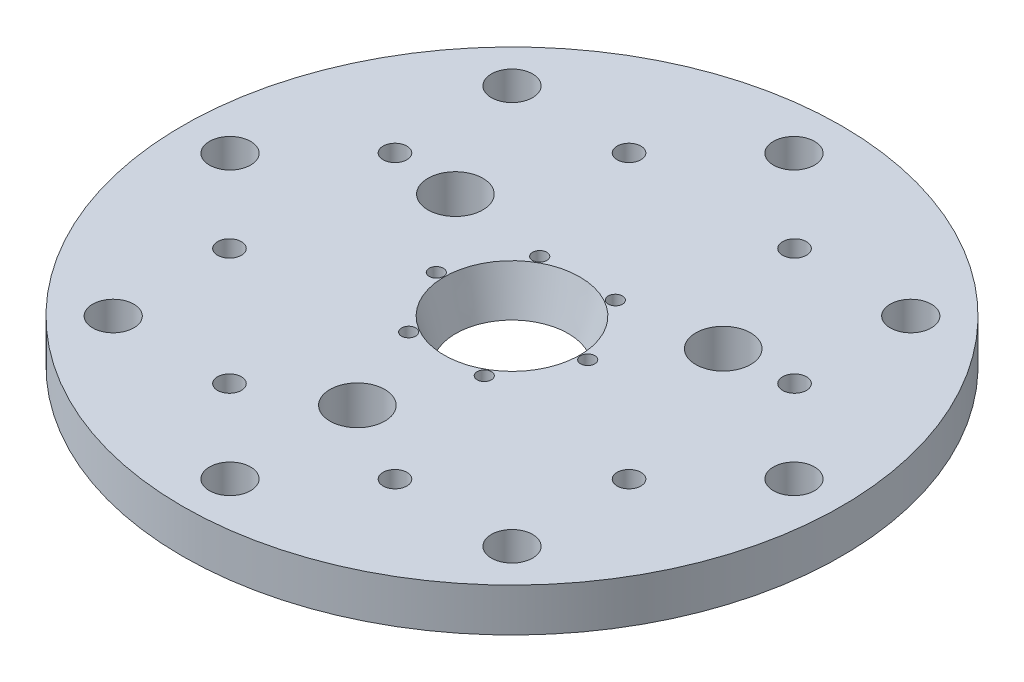
ISO-10303-21;
HEADER;
FILE_DESCRIPTION(('STEP AP214'),'2;1');
FILE_NAME('part.step','',(''),(''),'','','');
FILE_SCHEMA(('AUTOMOTIVE_DESIGN { 1 0 10303 214 1 1 1 1 }'));
ENDSEC;
DATA;
#1=APPLICATION_CONTEXT('core data for automotive mechanical design processes');
#2=APPLICATION_PROTOCOL_DEFINITION('international standard','automotive_design',2000,#1);
#3=PRODUCT_CONTEXT('',#1,'mechanical');
#4=PRODUCT('Part','Part','',(#3));
#5=PRODUCT_RELATED_PRODUCT_CATEGORY('part','',(#4));
#6=PRODUCT_DEFINITION_FORMATION('','',#4);
#7=PRODUCT_DEFINITION_CONTEXT('part definition',#1,'design');
#8=PRODUCT_DEFINITION('design','',#6,#7);
#9=PRODUCT_DEFINITION_SHAPE('','',#8);
#10=(LENGTH_UNIT() NAMED_UNIT(*) SI_UNIT(.MILLI.,.METRE.));
#11=(NAMED_UNIT(*) PLANE_ANGLE_UNIT() SI_UNIT($,.RADIAN.));
#12=(NAMED_UNIT(*) SI_UNIT($,.STERADIAN.) SOLID_ANGLE_UNIT());
#13=UNCERTAINTY_MEASURE_WITH_UNIT(LENGTH_MEASURE(1.E-05),#10,'distance_accuracy_value','');
#14=(GEOMETRIC_REPRESENTATION_CONTEXT(3) GLOBAL_UNCERTAINTY_ASSIGNED_CONTEXT((#13)) GLOBAL_UNIT_ASSIGNED_CONTEXT((#10,
#11,#12)) REPRESENTATION_CONTEXT('',''));
#15=CARTESIAN_POINT('',(0.,0.,0.));
#16=DIRECTION('',(0.,0.,1.));
#17=DIRECTION('',(1.,0.,0.));
#18=AXIS2_PLACEMENT_3D('',#15,#16,#17);
#19=CARTESIAN_POINT('',(0.,10.,0.));
#20=DIRECTION('',(0.,-1.,0.));
#21=DIRECTION('',(0.,0.,-1.));
#22=AXIS2_PLACEMENT_3D('',#19,#20,#21);
#23=CYLINDRICAL_SURFACE('',#22,76.2);
#24=CARTESIAN_POINT('',(0.,10.,0.));
#25=DIRECTION('',(0.,1.,0.));
#26=DIRECTION('',(0.,0.,1.));
#27=AXIS2_PLACEMENT_3D('',#24,#25,#26);
#28=CIRCLE('',#27,76.2);
#29=CARTESIAN_POINT('',(0.,10.,76.2));
#30=VERTEX_POINT('',#29);
#31=EDGE_CURVE('E11',#30,#30,#28,.T.);
#32=ORIENTED_EDGE('',*,*,#31,.F.);
#33=EDGE_LOOP('',(#32));
#34=FACE_BOUND('',#33,.T.);
#35=CARTESIAN_POINT('',(0.,0.,0.));
#36=DIRECTION('',(0.,1.,0.));
#37=DIRECTION('',(0.,0.,1.));
#38=AXIS2_PLACEMENT_3D('',#35,#36,#37);
#39=CIRCLE('',#38,76.2);
#40=CARTESIAN_POINT('',(0.,0.,76.2));
#41=VERTEX_POINT('',#40);
#42=EDGE_CURVE('E44',#41,#41,#39,.T.);
#43=ORIENTED_EDGE('',*,*,#42,.T.);
#44=EDGE_LOOP('',(#43));
#45=FACE_BOUND('',#44,.T.);
#46=ADVANCED_FACE('F41',(#34,#45),#23,.T.);
#47=CARTESIAN_POINT('',(0.,10.,0.));
#48=DIRECTION('',(0.,1.,0.));
#49=DIRECTION('',(0.,0.,1.));
#50=AXIS2_PLACEMENT_3D('',#47,#48,#49);
#51=PLANE('',#50);
#52=CARTESIAN_POINT('',(8.75000000000018,10.,-15.1554445662276));
#53=DIRECTION('',(0.,1.,0.));
#54=DIRECTION('',(0.,0.,1.));
#55=AXIS2_PLACEMENT_3D('',#52,#53,#54);
#56=CIRCLE('',#55,1.65);
#57=CARTESIAN_POINT('',(8.75000000000018,10.,-13.5054445662276));
#58=VERTEX_POINT('',#57);
#59=EDGE_CURVE('E78',#58,#58,#56,.T.);
#60=ORIENTED_EDGE('',*,*,#59,.F.);
#61=EDGE_LOOP('',(#60));
#62=FACE_BOUND('',#61,.T.);
#63=CARTESIAN_POINT('',(-8.74999999999986,10.,-15.1554445662278));
#64=DIRECTION('',(0.,1.,0.));
#65=DIRECTION('',(0.,0.,1.));
#66=AXIS2_PLACEMENT_3D('',#63,#64,#65);
#67=CIRCLE('',#66,1.65);
#68=CARTESIAN_POINT('',(-8.74999999999986,10.,-13.5054445662278));
#69=VERTEX_POINT('',#68);
#70=EDGE_CURVE('E77',#69,#69,#67,.T.);
#71=ORIENTED_EDGE('',*,*,#70,.F.);
#72=EDGE_LOOP('',(#71));
#73=FACE_BOUND('',#72,.T.);
#74=CARTESIAN_POINT('',(-17.5,10.,0.));
#75=DIRECTION('',(0.,1.,0.));
#76=DIRECTION('',(0.,0.,1.));
#77=AXIS2_PLACEMENT_3D('',#74,#75,#76);
#78=CIRCLE('',#77,1.65);
#79=CARTESIAN_POINT('',(-17.5,10.,1.65));
#80=VERTEX_POINT('',#79);
#81=EDGE_CURVE('E88',#80,#80,#78,.T.);
#82=ORIENTED_EDGE('',*,*,#81,.F.);
#83=EDGE_LOOP('',(#82));
#84=FACE_BOUND('',#83,.T.);
#85=CARTESIAN_POINT('',(-8.75000000000007,10.,15.1554445662276));
#86=DIRECTION('',(0.,1.,0.));
#87=DIRECTION('',(0.,0.,1.));
#88=AXIS2_PLACEMENT_3D('',#85,#86,#87);
#89=CIRCLE('',#88,1.65);
#90=CARTESIAN_POINT('',(-8.75000000000007,10.,16.8054445662276));
#91=VERTEX_POINT('',#90);
#92=EDGE_CURVE('E94',#91,#91,#89,.T.);
#93=ORIENTED_EDGE('',*,*,#92,.F.);
#94=EDGE_LOOP('',(#93));
#95=FACE_BOUND('',#94,.T.);
#96=CARTESIAN_POINT('',(8.74999999999997,10.,15.1554445662277));
#97=DIRECTION('',(0.,1.,0.));
#98=DIRECTION('',(0.,0.,1.));
#99=AXIS2_PLACEMENT_3D('',#96,#97,#98);
#100=CIRCLE('',#99,1.65);
#101=CARTESIAN_POINT('',(8.74999999999997,10.,16.8054445662277));
#102=VERTEX_POINT('',#101);
#103=EDGE_CURVE('E100',#102,#102,#100,.T.);
#104=ORIENTED_EDGE('',*,*,#103,.F.);
#105=EDGE_LOOP('',(#104));
#106=FACE_BOUND('',#105,.T.);
#107=CARTESIAN_POINT('',(17.5,10.,0.));
#108=DIRECTION('',(0.,1.,0.));
#109=DIRECTION('',(0.,0.,1.));
#110=AXIS2_PLACEMENT_3D('',#107,#108,#109);
#111=CIRCLE('',#110,1.65);
#112=CARTESIAN_POINT('',(17.5,10.,1.65));
#113=VERTEX_POINT('',#112);
#114=EDGE_CURVE('E106',#113,#113,#111,.T.);
#115=ORIENTED_EDGE('',*,*,#114,.F.);
#116=EDGE_LOOP('',(#115));
#117=FACE_BOUND('',#116,.T.);
#118=CARTESIAN_POINT('',(-46.1033621333635,10.,-46.1033621333623));
#119=DIRECTION('',(0.,1.,0.));
#120=DIRECTION('',(0.,0.,1.));
#121=AXIS2_PLACEMENT_3D('',#118,#119,#120);
#122=CIRCLE('',#121,4.76249999999999);
#123=CARTESIAN_POINT('',(-46.1033621333635,10.,-41.3408621333624));
#124=VERTEX_POINT('',#123);
#125=EDGE_CURVE('E112',#124,#124,#122,.T.);
#126=ORIENTED_EDGE('',*,*,#125,.F.);
#127=EDGE_LOOP('',(#126));
#128=FACE_BOUND('',#127,.T.);
#129=CARTESIAN_POINT('',(-6.82933749877717E-13,10.,-65.2));
#130=DIRECTION('',(0.,1.,0.));
#131=DIRECTION('',(0.,0.,1.));
#132=AXIS2_PLACEMENT_3D('',#129,#130,#131);
#133=CIRCLE('',#132,4.76249999999999);
#134=CARTESIAN_POINT('',(-6.82933749877717E-13,10.,-60.4375));
#135=VERTEX_POINT('',#134);
#136=EDGE_CURVE('E118',#135,#135,#133,.T.);
#137=ORIENTED_EDGE('',*,*,#136,.F.);
#138=EDGE_LOOP('',(#137));
#139=FACE_BOUND('',#138,.T.);
#140=CARTESIAN_POINT('',(46.1033621333625,10.,-46.1033621333633));
#141=DIRECTION('',(0.,1.,0.));
#142=DIRECTION('',(0.,0.,1.));
#143=AXIS2_PLACEMENT_3D('',#140,#141,#142);
#144=CIRCLE('',#143,4.76249999999999);
#145=CARTESIAN_POINT('',(46.1033621333625,10.,-41.3408621333633));
#146=VERTEX_POINT('',#145);
#147=EDGE_CURVE('E124',#146,#146,#144,.T.);
#148=ORIENTED_EDGE('',*,*,#147,.F.);
#149=EDGE_LOOP('',(#148));
#150=FACE_BOUND('',#149,.T.);
#151=CARTESIAN_POINT('',(65.2,10.,0.));
#152=DIRECTION('',(0.,1.,0.));
#153=DIRECTION('',(0.,0.,1.));
#154=AXIS2_PLACEMENT_3D('',#151,#152,#153);
#155=CIRCLE('',#154,4.76249999999999);
#156=CARTESIAN_POINT('',(65.2,10.,4.76249999999999));
#157=VERTEX_POINT('',#156);
#158=EDGE_CURVE('E130',#157,#157,#155,.T.);
#159=ORIENTED_EDGE('',*,*,#158,.F.);
#160=EDGE_LOOP('',(#159));
#161=FACE_BOUND('',#160,.T.);
#162=CARTESIAN_POINT('',(46.1033621333631,10.,46.1033621333627));
#163=DIRECTION('',(0.,1.,0.));
#164=DIRECTION('',(0.,0.,1.));
#165=AXIS2_PLACEMENT_3D('',#162,#163,#164);
#166=CIRCLE('',#165,4.76249999999999);
#167=CARTESIAN_POINT('',(46.1033621333631,10.,50.8658621333627));
#168=VERTEX_POINT('',#167);
#169=EDGE_CURVE('E136',#168,#168,#166,.T.);
#170=ORIENTED_EDGE('',*,*,#169,.F.);
#171=EDGE_LOOP('',(#170));
#172=FACE_BOUND('',#171,.T.);
#173=CARTESIAN_POINT('',(2.27644583292572E-13,10.,65.2));
#174=DIRECTION('',(0.,1.,0.));
#175=DIRECTION('',(0.,0.,1.));
#176=AXIS2_PLACEMENT_3D('',#173,#174,#175);
#177=CIRCLE('',#176,4.76249999999999);
#178=CARTESIAN_POINT('',(2.27644583292572E-13,10.,69.9625));
#179=VERTEX_POINT('',#178);
#180=EDGE_CURVE('E142',#179,#179,#177,.T.);
#181=ORIENTED_EDGE('',*,*,#180,.F.);
#182=EDGE_LOOP('',(#181));
#183=FACE_BOUND('',#182,.T.);
#184=CARTESIAN_POINT('',(-46.1033621333628,10.,46.103362133363));
#185=DIRECTION('',(0.,1.,0.));
#186=DIRECTION('',(0.,0.,1.));
#187=AXIS2_PLACEMENT_3D('',#184,#185,#186);
#188=CIRCLE('',#187,4.76249999999999);
#189=CARTESIAN_POINT('',(-46.1033621333628,10.,50.865862133363));
#190=VERTEX_POINT('',#189);
#191=EDGE_CURVE('E148',#190,#190,#188,.T.);
#192=ORIENTED_EDGE('',*,*,#191,.F.);
#193=EDGE_LOOP('',(#192));
#194=FACE_BOUND('',#193,.T.);
#195=CARTESIAN_POINT('',(-65.2,10.,0.));
#196=DIRECTION('',(0.,1.,0.));
#197=DIRECTION('',(0.,0.,1.));
#198=AXIS2_PLACEMENT_3D('',#195,#196,#197);
#199=CIRCLE('',#198,4.76249999999999);
#200=CARTESIAN_POINT('',(-65.2,10.,4.76249999999999));
#201=VERTEX_POINT('',#200);
#202=EDGE_CURVE('E154',#201,#201,#199,.T.);
#203=ORIENTED_EDGE('',*,*,#202,.F.);
#204=EDGE_LOOP('',(#203));
#205=FACE_BOUND('',#204,.T.);
#206=CARTESIAN_POINT('',(-30.9604081852938,10.,-17.8749999999998));
#207=DIRECTION('',(0.,1.,0.));
#208=DIRECTION('',(0.866025403784436,0.,-0.500000000000004));
#209=AXIS2_PLACEMENT_3D('',#206,#207,#208);
#210=CIRCLE('',#209,6.35);
#211=CARTESIAN_POINT('',(-25.4611468712626,10.,-21.0499999999998));
#212=VERTEX_POINT('',#211);
#213=EDGE_CURVE('E165',#212,#212,#210,.T.);
#214=ORIENTED_EDGE('',*,*,#213,.F.);
#215=EDGE_LOOP('',(#214));
#216=FACE_BOUND('',#215,.T.);
#217=CARTESIAN_POINT('',(3.81639164714898E-13,10.,35.75));
#218=DIRECTION('',(0.,1.,0.));
#219=DIRECTION('',(-0.866025403784443,0.,-0.499999999999992));
#220=AXIS2_PLACEMENT_3D('',#217,#218,#219);
#221=CIRCLE('',#220,6.35);
#222=CARTESIAN_POINT('',(-5.49926131403083,10.,32.575));
#223=VERTEX_POINT('',#222);
#224=EDGE_CURVE('E160',#223,#223,#221,.T.);
#225=ORIENTED_EDGE('',*,*,#224,.F.);
#226=EDGE_LOOP('',(#225));
#227=FACE_BOUND('',#226,.T.);
#228=CARTESIAN_POINT('',(30.9604081852937,10.,-17.875));
#229=DIRECTION('',(0.,1.,0.));
#230=DIRECTION('',(0.,0.,1.));
#231=AXIS2_PLACEMENT_3D('',#228,#229,#230);
#232=CIRCLE('',#231,6.35);
#233=CARTESIAN_POINT('',(30.9604081852937,10.,-11.525));
#234=VERTEX_POINT('',#233);
#235=EDGE_CURVE('E164',#234,#234,#232,.T.);
#236=ORIENTED_EDGE('',*,*,#235,.F.);
#237=EDGE_LOOP('',(#236));
#238=FACE_BOUND('',#237,.T.);
#239=CARTESIAN_POINT('',(46.1939766255646,10.,19.1341716182539));
#240=DIRECTION('',(0.,1.,0.));
#241=DIRECTION('',(-0.707106781186539,0.,0.707106781186556));
#242=AXIS2_PLACEMENT_3D('',#239,#240,#241);
#243=CIRCLE('',#242,2.75);
#244=CARTESIAN_POINT('',(44.2494329773016,10.,21.0787152665169));
#245=VERTEX_POINT('',#244);
#246=EDGE_CURVE('E210',#245,#245,#243,.T.);
#247=ORIENTED_EDGE('',*,*,#246,.F.);
#248=EDGE_LOOP('',(#247));
#249=FACE_BOUND('',#248,.T.);
#250=CARTESIAN_POINT('',(19.134171618255,10.,46.1939766255641));
#251=DIRECTION('',(0.,1.,0.));
#252=DIRECTION('',(-1.,0.,0.));
#253=AXIS2_PLACEMENT_3D('',#250,#251,#252);
#254=CIRCLE('',#253,2.75);
#255=CARTESIAN_POINT('',(16.384171618255,10.,46.1939766255642));
#256=VERTEX_POINT('',#255);
#257=EDGE_CURVE('E204',#256,#256,#254,.T.);
#258=ORIENTED_EDGE('',*,*,#257,.F.);
#259=EDGE_LOOP('',(#258));
#260=FACE_BOUND('',#259,.T.);
#261=CARTESIAN_POINT('',(-19.1341716182541,10.,46.1939766255645));
#262=DIRECTION('',(0.,1.,0.));
#263=DIRECTION('',(-0.707106781186554,0.,-0.707106781186541));
#264=AXIS2_PLACEMENT_3D('',#261,#262,#263);
#265=CIRCLE('',#264,2.75);
#266=CARTESIAN_POINT('',(-21.0787152665171,10.,44.2494329773015));
#267=VERTEX_POINT('',#266);
#268=EDGE_CURVE('E198',#267,#267,#265,.T.);
#269=ORIENTED_EDGE('',*,*,#268,.F.);
#270=EDGE_LOOP('',(#269));
#271=FACE_BOUND('',#270,.T.);
#272=CARTESIAN_POINT('',(-46.1939766255643,10.,19.1341716182545));
#273=DIRECTION('',(0.,1.,0.));
#274=DIRECTION('',(0.,0.,-1.));
#275=AXIS2_PLACEMENT_3D('',#272,#273,#274);
#276=CIRCLE('',#275,2.75);
#277=CARTESIAN_POINT('',(-46.1939766255643,10.,16.3841716182545));
#278=VERTEX_POINT('',#277);
#279=EDGE_CURVE('E192',#278,#278,#276,.T.);
#280=ORIENTED_EDGE('',*,*,#279,.F.);
#281=EDGE_LOOP('',(#280));
#282=FACE_BOUND('',#281,.T.);
#283=CARTESIAN_POINT('',(-46.1939766255645,10.,-19.1341716182542));
#284=DIRECTION('',(0.,1.,0.));
#285=DIRECTION('',(0.707106781186544,0.,-0.707106781186551));
#286=AXIS2_PLACEMENT_3D('',#283,#284,#285);
#287=CIRCLE('',#286,2.75);
#288=CARTESIAN_POINT('',(-44.2494329773015,10.,-21.0787152665172));
#289=VERTEX_POINT('',#288);
#290=EDGE_CURVE('E186',#289,#289,#287,.T.);
#291=ORIENTED_EDGE('',*,*,#290,.F.);
#292=EDGE_LOOP('',(#291));
#293=FACE_BOUND('',#292,.T.);
#294=CARTESIAN_POINT('',(-19.1341716182547,10.,-46.1939766255643));
#295=DIRECTION('',(0.,1.,0.));
#296=DIRECTION('',(1.,0.,0.));
#297=AXIS2_PLACEMENT_3D('',#294,#295,#296);
#298=CIRCLE('',#297,2.75);
#299=CARTESIAN_POINT('',(-16.3841716182547,10.,-46.1939766255643));
#300=VERTEX_POINT('',#299);
#301=EDGE_CURVE('E179',#300,#300,#298,.T.);
#302=ORIENTED_EDGE('',*,*,#301,.F.);
#303=EDGE_LOOP('',(#302));
#304=FACE_BOUND('',#303,.T.);
#305=CARTESIAN_POINT('',(19.1341716182544,10.,-46.1939766255644));
#306=DIRECTION('',(0.,1.,0.));
#307=DIRECTION('',(0.707106781186549,0.,0.707106781186546));
#308=AXIS2_PLACEMENT_3D('',#305,#306,#307);
#309=CIRCLE('',#308,2.75);
#310=CARTESIAN_POINT('',(21.0787152665174,10.,-44.2494329773014));
#311=VERTEX_POINT('',#310);
#312=EDGE_CURVE('E215',#311,#311,#309,.T.);
#313=ORIENTED_EDGE('',*,*,#312,.F.);
#314=EDGE_LOOP('',(#313));
#315=FACE_BOUND('',#314,.T.);
#316=CARTESIAN_POINT('',(46.1939766255643,10.,-19.1341716182545));
#317=DIRECTION('',(0.,1.,0.));
#318=DIRECTION('',(0.,0.,1.));
#319=AXIS2_PLACEMENT_3D('',#316,#317,#318);
#320=CIRCLE('',#319,2.75);
#321=CARTESIAN_POINT('',(46.1939766255643,10.,-16.3841716182545));
#322=VERTEX_POINT('',#321);
#323=EDGE_CURVE('E221',#322,#322,#320,.T.);
#324=ORIENTED_EDGE('',*,*,#323,.F.);
#325=EDGE_LOOP('',(#324));
#326=FACE_BOUND('',#325,.T.);
#327=CARTESIAN_POINT('',(0.,10.,0.));
#328=DIRECTION('',(0.,-1.,0.));
#329=DIRECTION('',(0.,0.,-1.));
#330=AXIS2_PLACEMENT_3D('',#327,#328,#329);
#331=CIRCLE('',#330,15.6794919243112);
#332=CARTESIAN_POINT('',(0.,10.,-15.6794919243112));
#333=VERTEX_POINT('',#332);
#334=EDGE_CURVE('E224',#333,#333,#331,.T.);
#335=ORIENTED_EDGE('',*,*,#334,.T.);
#336=EDGE_LOOP('',(#335));
#337=FACE_BOUND('',#336,.T.);
#338=ORIENTED_EDGE('',*,*,#31,.T.);
#339=EDGE_LOOP('',(#338));
#340=FACE_BOUND('',#339,.T.);
#341=ADVANCED_FACE('F240',(#62,#73,#84,#95,#106,#117,#128,#139,#150,#161,#172,#183,#194,#205,
#216,#227,#238,#249,#260,#271,#282,#293,#304,#315,#326,#337,#340),#51,.T.);
#342=CARTESIAN_POINT('',(0.,0.,0.));
#343=DIRECTION('',(0.,1.,0.));
#344=DIRECTION('',(0.,0.,1.));
#345=AXIS2_PLACEMENT_3D('',#342,#343,#344);
#346=PLANE('',#345);
#347=CARTESIAN_POINT('',(-46.1033621333635,0.,-46.1033621333623));
#348=DIRECTION('',(0.,1.,0.));
#349=DIRECTION('',(0.,0.,1.));
#350=AXIS2_PLACEMENT_3D('',#347,#348,#349);
#351=CIRCLE('',#350,4.7625);
#352=CARTESIAN_POINT('',(-46.1033621333635,0.,-41.3408621333624));
#353=VERTEX_POINT('',#352);
#354=EDGE_CURVE('E115',#353,#353,#351,.T.);
#355=ORIENTED_EDGE('',*,*,#354,.T.);
#356=EDGE_LOOP('',(#355));
#357=FACE_BOUND('',#356,.T.);
#358=CARTESIAN_POINT('',(-6.82933749877717E-13,0.,-65.2));
#359=DIRECTION('',(0.,1.,0.));
#360=DIRECTION('',(0.,0.,1.));
#361=AXIS2_PLACEMENT_3D('',#358,#359,#360);
#362=CIRCLE('',#361,4.76249999999999);
#363=CARTESIAN_POINT('',(-6.82933749877717E-13,0.,-60.4375));
#364=VERTEX_POINT('',#363);
#365=EDGE_CURVE('E121',#364,#364,#362,.T.);
#366=ORIENTED_EDGE('',*,*,#365,.T.);
#367=EDGE_LOOP('',(#366));
#368=FACE_BOUND('',#367,.T.);
#369=CARTESIAN_POINT('',(46.1033621333625,0.,-46.1033621333633));
#370=DIRECTION('',(0.,1.,0.));
#371=DIRECTION('',(0.,0.,1.));
#372=AXIS2_PLACEMENT_3D('',#369,#370,#371);
#373=CIRCLE('',#372,4.7625);
#374=CARTESIAN_POINT('',(46.1033621333625,0.,-41.3408621333633));
#375=VERTEX_POINT('',#374);
#376=EDGE_CURVE('E127',#375,#375,#373,.T.);
#377=ORIENTED_EDGE('',*,*,#376,.T.);
#378=EDGE_LOOP('',(#377));
#379=FACE_BOUND('',#378,.T.);
#380=CARTESIAN_POINT('',(65.2,0.,0.));
#381=DIRECTION('',(0.,1.,0.));
#382=DIRECTION('',(0.,0.,1.));
#383=AXIS2_PLACEMENT_3D('',#380,#381,#382);
#384=CIRCLE('',#383,4.76249999999999);
#385=CARTESIAN_POINT('',(65.2,0.,4.76249999999999));
#386=VERTEX_POINT('',#385);
#387=EDGE_CURVE('E133',#386,#386,#384,.T.);
#388=ORIENTED_EDGE('',*,*,#387,.T.);
#389=EDGE_LOOP('',(#388));
#390=FACE_BOUND('',#389,.T.);
#391=CARTESIAN_POINT('',(46.1033621333631,0.,46.1033621333627));
#392=DIRECTION('',(0.,1.,0.));
#393=DIRECTION('',(0.,0.,1.));
#394=AXIS2_PLACEMENT_3D('',#391,#392,#393);
#395=CIRCLE('',#394,4.7625);
#396=CARTESIAN_POINT('',(46.1033621333631,0.,50.8658621333627));
#397=VERTEX_POINT('',#396);
#398=EDGE_CURVE('E139',#397,#397,#395,.T.);
#399=ORIENTED_EDGE('',*,*,#398,.T.);
#400=EDGE_LOOP('',(#399));
#401=FACE_BOUND('',#400,.T.);
#402=CARTESIAN_POINT('',(2.27644583292572E-13,0.,65.2));
#403=DIRECTION('',(0.,1.,0.));
#404=DIRECTION('',(0.,0.,1.));
#405=AXIS2_PLACEMENT_3D('',#402,#403,#404);
#406=CIRCLE('',#405,4.76249999999999);
#407=CARTESIAN_POINT('',(2.27644583292572E-13,0.,69.9625));
#408=VERTEX_POINT('',#407);
#409=EDGE_CURVE('E145',#408,#408,#406,.T.);
#410=ORIENTED_EDGE('',*,*,#409,.T.);
#411=EDGE_LOOP('',(#410));
#412=FACE_BOUND('',#411,.T.);
#413=CARTESIAN_POINT('',(-46.1033621333628,0.,46.103362133363));
#414=DIRECTION('',(0.,1.,0.));
#415=DIRECTION('',(0.,0.,1.));
#416=AXIS2_PLACEMENT_3D('',#413,#414,#415);
#417=CIRCLE('',#416,4.7625);
#418=CARTESIAN_POINT('',(-46.1033621333628,0.,50.865862133363));
#419=VERTEX_POINT('',#418);
#420=EDGE_CURVE('E151',#419,#419,#417,.T.);
#421=ORIENTED_EDGE('',*,*,#420,.T.);
#422=EDGE_LOOP('',(#421));
#423=FACE_BOUND('',#422,.T.);
#424=CARTESIAN_POINT('',(-65.2,0.,0.));
#425=DIRECTION('',(0.,1.,0.));
#426=DIRECTION('',(0.,0.,1.));
#427=AXIS2_PLACEMENT_3D('',#424,#425,#426);
#428=CIRCLE('',#427,4.7625);
#429=CARTESIAN_POINT('',(-65.2,0.,4.7625));
#430=VERTEX_POINT('',#429);
#431=EDGE_CURVE('E157',#430,#430,#428,.T.);
#432=ORIENTED_EDGE('',*,*,#431,.T.);
#433=EDGE_LOOP('',(#432));
#434=FACE_BOUND('',#433,.T.);
#435=CARTESIAN_POINT('',(-30.9604081852938,0.,-17.8749999999998));
#436=DIRECTION('',(0.,1.,0.));
#437=DIRECTION('',(0.866025403784436,0.,-0.500000000000004));
#438=AXIS2_PLACEMENT_3D('',#435,#436,#437);
#439=CIRCLE('',#438,6.35);
#440=CARTESIAN_POINT('',(-25.4611468712626,0.,-21.0499999999998));
#441=VERTEX_POINT('',#440);
#442=EDGE_CURVE('E161',#441,#441,#439,.T.);
#443=ORIENTED_EDGE('',*,*,#442,.T.);
#444=EDGE_LOOP('',(#443));
#445=FACE_BOUND('',#444,.T.);
#446=CARTESIAN_POINT('',(3.81639164714898E-13,0.,35.75));
#447=DIRECTION('',(0.,1.,0.));
#448=DIRECTION('',(-0.866025403784443,0.,-0.499999999999992));
#449=AXIS2_PLACEMENT_3D('',#446,#447,#448);
#450=CIRCLE('',#449,6.35);
#451=CARTESIAN_POINT('',(-5.49926131403083,0.,32.575));
#452=VERTEX_POINT('',#451);
#453=EDGE_CURVE('E168',#452,#452,#450,.T.);
#454=ORIENTED_EDGE('',*,*,#453,.T.);
#455=EDGE_LOOP('',(#454));
#456=FACE_BOUND('',#455,.T.);
#457=CARTESIAN_POINT('',(30.9604081852937,0.,-17.875));
#458=DIRECTION('',(0.,1.,0.));
#459=DIRECTION('',(0.,0.,1.));
#460=AXIS2_PLACEMENT_3D('',#457,#458,#459);
#461=CIRCLE('',#460,6.35);
#462=CARTESIAN_POINT('',(30.9604081852937,0.,-11.525));
#463=VERTEX_POINT('',#462);
#464=EDGE_CURVE('E173',#463,#463,#461,.T.);
#465=ORIENTED_EDGE('',*,*,#464,.T.);
#466=EDGE_LOOP('',(#465));
#467=FACE_BOUND('',#466,.T.);
#468=CARTESIAN_POINT('',(46.1939766255646,0.,19.1341716182539));
#469=DIRECTION('',(0.,1.,0.));
#470=DIRECTION('',(-0.707106781186539,0.,0.707106781186556));
#471=AXIS2_PLACEMENT_3D('',#468,#469,#470);
#472=CIRCLE('',#471,2.75);
#473=CARTESIAN_POINT('',(44.2494329773016,0.,21.0787152665169));
#474=VERTEX_POINT('',#473);
#475=EDGE_CURVE('E176',#474,#474,#472,.T.);
#476=ORIENTED_EDGE('',*,*,#475,.T.);
#477=EDGE_LOOP('',(#476));
#478=FACE_BOUND('',#477,.T.);
#479=CARTESIAN_POINT('',(19.134171618255,0.,46.1939766255641));
#480=DIRECTION('',(0.,1.,0.));
#481=DIRECTION('',(-1.,0.,0.));
#482=AXIS2_PLACEMENT_3D('',#479,#480,#481);
#483=CIRCLE('',#482,2.75);
#484=CARTESIAN_POINT('',(16.384171618255,0.,46.1939766255642));
#485=VERTEX_POINT('',#484);
#486=EDGE_CURVE('E207',#485,#485,#483,.T.);
#487=ORIENTED_EDGE('',*,*,#486,.T.);
#488=EDGE_LOOP('',(#487));
#489=FACE_BOUND('',#488,.T.);
#490=CARTESIAN_POINT('',(-19.1341716182541,0.,46.1939766255645));
#491=DIRECTION('',(0.,1.,0.));
#492=DIRECTION('',(-0.707106781186554,0.,-0.707106781186541));
#493=AXIS2_PLACEMENT_3D('',#490,#491,#492);
#494=CIRCLE('',#493,2.75);
#495=CARTESIAN_POINT('',(-21.0787152665171,0.,44.2494329773015));
#496=VERTEX_POINT('',#495);
#497=EDGE_CURVE('E201',#496,#496,#494,.T.);
#498=ORIENTED_EDGE('',*,*,#497,.T.);
#499=EDGE_LOOP('',(#498));
#500=FACE_BOUND('',#499,.T.);
#501=CARTESIAN_POINT('',(-46.1939766255643,0.,19.1341716182545));
#502=DIRECTION('',(0.,1.,0.));
#503=DIRECTION('',(0.,0.,-1.));
#504=AXIS2_PLACEMENT_3D('',#501,#502,#503);
#505=CIRCLE('',#504,2.75);
#506=CARTESIAN_POINT('',(-46.1939766255643,0.,16.3841716182545));
#507=VERTEX_POINT('',#506);
#508=EDGE_CURVE('E195',#507,#507,#505,.T.);
#509=ORIENTED_EDGE('',*,*,#508,.T.);
#510=EDGE_LOOP('',(#509));
#511=FACE_BOUND('',#510,.T.);
#512=CARTESIAN_POINT('',(-46.1939766255645,0.,-19.1341716182542));
#513=DIRECTION('',(0.,1.,0.));
#514=DIRECTION('',(0.707106781186544,0.,-0.707106781186551));
#515=AXIS2_PLACEMENT_3D('',#512,#513,#514);
#516=CIRCLE('',#515,2.75);
#517=CARTESIAN_POINT('',(-44.2494329773015,0.,-21.0787152665172));
#518=VERTEX_POINT('',#517);
#519=EDGE_CURVE('E189',#518,#518,#516,.T.);
#520=ORIENTED_EDGE('',*,*,#519,.T.);
#521=EDGE_LOOP('',(#520));
#522=FACE_BOUND('',#521,.T.);
#523=CARTESIAN_POINT('',(-19.1341716182547,0.,-46.1939766255643));
#524=DIRECTION('',(0.,1.,0.));
#525=DIRECTION('',(1.,0.,0.));
#526=AXIS2_PLACEMENT_3D('',#523,#524,#525);
#527=CIRCLE('',#526,2.75);
#528=CARTESIAN_POINT('',(-16.3841716182547,0.,-46.1939766255643));
#529=VERTEX_POINT('',#528);
#530=EDGE_CURVE('E183',#529,#529,#527,.T.);
#531=ORIENTED_EDGE('',*,*,#530,.T.);
#532=EDGE_LOOP('',(#531));
#533=FACE_BOUND('',#532,.T.);
#534=CARTESIAN_POINT('',(19.1341716182544,0.,-46.1939766255644));
#535=DIRECTION('',(0.,1.,0.));
#536=DIRECTION('',(0.707106781186549,0.,0.707106781186546));
#537=AXIS2_PLACEMENT_3D('',#534,#535,#536);
#538=CIRCLE('',#537,2.75);
#539=CARTESIAN_POINT('',(21.0787152665174,0.,-44.2494329773014));
#540=VERTEX_POINT('',#539);
#541=EDGE_CURVE('E182',#540,#540,#538,.T.);
#542=ORIENTED_EDGE('',*,*,#541,.T.);
#543=EDGE_LOOP('',(#542));
#544=FACE_BOUND('',#543,.T.);
#545=CARTESIAN_POINT('',(46.1939766255643,0.,-19.1341716182545));
#546=DIRECTION('',(0.,1.,0.));
#547=DIRECTION('',(0.,0.,1.));
#548=AXIS2_PLACEMENT_3D('',#545,#546,#547);
#549=CIRCLE('',#548,2.75);
#550=CARTESIAN_POINT('',(46.1939766255643,0.,-16.3841716182545));
#551=VERTEX_POINT('',#550);
#552=EDGE_CURVE('E218',#551,#551,#549,.T.);
#553=ORIENTED_EDGE('',*,*,#552,.T.);
#554=EDGE_LOOP('',(#553));
#555=FACE_BOUND('',#554,.T.);
#556=CARTESIAN_POINT('',(0.,0.,0.));
#557=DIRECTION('',(0.,-1.,0.));
#558=DIRECTION('',(0.,0.,-1.));
#559=AXIS2_PLACEMENT_3D('',#556,#557,#558);
#560=CIRCLE('',#559,13.);
#561=CARTESIAN_POINT('',(0.,0.,-13.));
#562=VERTEX_POINT('',#561);
#563=EDGE_CURVE('E229',#562,#562,#560,.T.);
#564=ORIENTED_EDGE('',*,*,#563,.F.);
#565=EDGE_LOOP('',(#564));
#566=FACE_BOUND('',#565,.T.);
#567=ORIENTED_EDGE('',*,*,#42,.F.);
#568=EDGE_LOOP('',(#567));
#569=FACE_BOUND('',#568,.T.);
#570=ADVANCED_FACE('F237',(#357,#368,#379,#390,#401,#412,#423,#434,#445,#456,#467,#478,#489,
#500,#511,#522,#533,#544,#555,#566,#569),#346,.F.);
#571=CARTESIAN_POINT('',(0.,0.,0.));
#572=DIRECTION('',(0.,1.,0.));
#573=DIRECTION('',(0.,0.,1.));
#574=AXIS2_PLACEMENT_3D('',#571,#572,#573);
#575=CONICAL_SURFACE('',#574,13.,0.26179938779915);
#576=ORIENTED_EDGE('',*,*,#334,.F.);
#577=EDGE_LOOP('',(#576));
#578=FACE_BOUND('',#577,.T.);
#579=ORIENTED_EDGE('',*,*,#563,.T.);
#580=EDGE_LOOP('',(#579));
#581=FACE_BOUND('',#580,.T.);
#582=ADVANCED_FACE('F239',(#578,#581),#575,.F.);
#583=CARTESIAN_POINT('',(46.1939766255643,10.,-19.1341716182545));
#584=DIRECTION('',(0.,-1.,0.));
#585=DIRECTION('',(0.,0.,-1.));
#586=AXIS2_PLACEMENT_3D('',#583,#584,#585);
#587=CYLINDRICAL_SURFACE('',#586,2.75);
#588=ORIENTED_EDGE('',*,*,#323,.T.);
#589=EDGE_LOOP('',(#588));
#590=FACE_BOUND('',#589,.T.);
#591=ORIENTED_EDGE('',*,*,#552,.F.);
#592=EDGE_LOOP('',(#591));
#593=FACE_BOUND('',#592,.T.);
#594=ADVANCED_FACE('F246',(#590,#593),#587,.F.);
#595=CARTESIAN_POINT('',(19.1341716182544,10.,-46.1939766255644));
#596=DIRECTION('',(0.,-1.,0.));
#597=DIRECTION('',(0.,0.,-1.));
#598=AXIS2_PLACEMENT_3D('',#595,#596,#597);
#599=CYLINDRICAL_SURFACE('',#598,2.75);
#600=ORIENTED_EDGE('',*,*,#312,.T.);
#601=EDGE_LOOP('',(#600));
#602=FACE_BOUND('',#601,.T.);
#603=ORIENTED_EDGE('',*,*,#541,.F.);
#604=EDGE_LOOP('',(#603));
#605=FACE_BOUND('',#604,.T.);
#606=ADVANCED_FACE('F474',(#602,#605),#599,.F.);
#607=CARTESIAN_POINT('',(-19.1341716182547,10.,-46.1939766255643));
#608=DIRECTION('',(0.,-1.,0.));
#609=DIRECTION('',(0.,0.,-1.));
#610=AXIS2_PLACEMENT_3D('',#607,#608,#609);
#611=CYLINDRICAL_SURFACE('',#610,2.75);
#612=ORIENTED_EDGE('',*,*,#301,.T.);
#613=EDGE_LOOP('',(#612));
#614=FACE_BOUND('',#613,.T.);
#615=ORIENTED_EDGE('',*,*,#530,.F.);
#616=EDGE_LOOP('',(#615));
#617=FACE_BOUND('',#616,.T.);
#618=ADVANCED_FACE('F466',(#614,#617),#611,.F.);
#619=CARTESIAN_POINT('',(-46.1939766255645,10.,-19.1341716182542));
#620=DIRECTION('',(0.,-1.,0.));
#621=DIRECTION('',(0.,0.,-1.));
#622=AXIS2_PLACEMENT_3D('',#619,#620,#621);
#623=CYLINDRICAL_SURFACE('',#622,2.75);
#624=ORIENTED_EDGE('',*,*,#290,.T.);
#625=EDGE_LOOP('',(#624));
#626=FACE_BOUND('',#625,.T.);
#627=ORIENTED_EDGE('',*,*,#519,.F.);
#628=EDGE_LOOP('',(#627));
#629=FACE_BOUND('',#628,.T.);
#630=ADVANCED_FACE('F458',(#626,#629),#623,.F.);
#631=CARTESIAN_POINT('',(-46.1939766255643,10.,19.1341716182545));
#632=DIRECTION('',(0.,-1.,0.));
#633=DIRECTION('',(0.,0.,-1.));
#634=AXIS2_PLACEMENT_3D('',#631,#632,#633);
#635=CYLINDRICAL_SURFACE('',#634,2.75);
#636=ORIENTED_EDGE('',*,*,#279,.T.);
#637=EDGE_LOOP('',(#636));
#638=FACE_BOUND('',#637,.T.);
#639=ORIENTED_EDGE('',*,*,#508,.F.);
#640=EDGE_LOOP('',(#639));
#641=FACE_BOUND('',#640,.T.);
#642=ADVANCED_FACE('F450',(#638,#641),#635,.F.);
#643=CARTESIAN_POINT('',(-19.1341716182541,10.,46.1939766255645));
#644=DIRECTION('',(0.,-1.,0.));
#645=DIRECTION('',(0.,0.,-1.));
#646=AXIS2_PLACEMENT_3D('',#643,#644,#645);
#647=CYLINDRICAL_SURFACE('',#646,2.75);
#648=ORIENTED_EDGE('',*,*,#268,.T.);
#649=EDGE_LOOP('',(#648));
#650=FACE_BOUND('',#649,.T.);
#651=ORIENTED_EDGE('',*,*,#497,.F.);
#652=EDGE_LOOP('',(#651));
#653=FACE_BOUND('',#652,.T.);
#654=ADVANCED_FACE('F442',(#650,#653),#647,.F.);
#655=CARTESIAN_POINT('',(19.134171618255,10.,46.1939766255641));
#656=DIRECTION('',(0.,-1.,0.));
#657=DIRECTION('',(0.,0.,-1.));
#658=AXIS2_PLACEMENT_3D('',#655,#656,#657);
#659=CYLINDRICAL_SURFACE('',#658,2.75);
#660=ORIENTED_EDGE('',*,*,#257,.T.);
#661=EDGE_LOOP('',(#660));
#662=FACE_BOUND('',#661,.T.);
#663=ORIENTED_EDGE('',*,*,#486,.F.);
#664=EDGE_LOOP('',(#663));
#665=FACE_BOUND('',#664,.T.);
#666=ADVANCED_FACE('F433',(#662,#665),#659,.F.);
#667=CARTESIAN_POINT('',(46.1939766255646,10.,19.1341716182539));
#668=DIRECTION('',(0.,-1.,0.));
#669=DIRECTION('',(0.,0.,-1.));
#670=AXIS2_PLACEMENT_3D('',#667,#668,#669);
#671=CYLINDRICAL_SURFACE('',#670,2.75);
#672=ORIENTED_EDGE('',*,*,#246,.T.);
#673=EDGE_LOOP('',(#672));
#674=FACE_BOUND('',#673,.T.);
#675=ORIENTED_EDGE('',*,*,#475,.F.);
#676=EDGE_LOOP('',(#675));
#677=FACE_BOUND('',#676,.T.);
#678=ADVANCED_FACE('F422',(#674,#677),#671,.F.);
#679=CARTESIAN_POINT('',(30.9604081852937,0.,-17.875));
#680=DIRECTION('',(0.,1.,0.));
#681=DIRECTION('',(0.,0.,1.));
#682=AXIS2_PLACEMENT_3D('',#679,#680,#681);
#683=CYLINDRICAL_SURFACE('',#682,6.35);
#684=ORIENTED_EDGE('',*,*,#464,.F.);
#685=EDGE_LOOP('',(#684));
#686=FACE_BOUND('',#685,.T.);
#687=ORIENTED_EDGE('',*,*,#235,.T.);
#688=EDGE_LOOP('',(#687));
#689=FACE_BOUND('',#688,.T.);
#690=ADVANCED_FACE('F401',(#686,#689),#683,.F.);
#691=CARTESIAN_POINT('',(3.81639164714898E-13,0.,35.75));
#692=DIRECTION('',(0.,1.,0.));
#693=DIRECTION('',(0.,0.,1.));
#694=AXIS2_PLACEMENT_3D('',#691,#692,#693);
#695=CYLINDRICAL_SURFACE('',#694,6.35);
#696=ORIENTED_EDGE('',*,*,#453,.F.);
#697=EDGE_LOOP('',(#696));
#698=FACE_BOUND('',#697,.T.);
#699=ORIENTED_EDGE('',*,*,#224,.T.);
#700=EDGE_LOOP('',(#699));
#701=FACE_BOUND('',#700,.T.);
#702=ADVANCED_FACE('F395',(#698,#701),#695,.F.);
#703=CARTESIAN_POINT('',(-30.9604081852938,0.,-17.8749999999998));
#704=DIRECTION('',(0.,1.,0.));
#705=DIRECTION('',(0.,0.,1.));
#706=AXIS2_PLACEMENT_3D('',#703,#704,#705);
#707=CYLINDRICAL_SURFACE('',#706,6.35);
#708=ORIENTED_EDGE('',*,*,#442,.F.);
#709=EDGE_LOOP('',(#708));
#710=FACE_BOUND('',#709,.T.);
#711=ORIENTED_EDGE('',*,*,#213,.T.);
#712=EDGE_LOOP('',(#711));
#713=FACE_BOUND('',#712,.T.);
#714=ADVANCED_FACE('F400',(#710,#713),#707,.F.);
#715=CARTESIAN_POINT('',(-65.2,10.,0.));
#716=DIRECTION('',(0.,1.,0.));
#717=DIRECTION('',(0.,0.,1.));
#718=AXIS2_PLACEMENT_3D('',#715,#716,#717);
#719=CYLINDRICAL_SURFACE('',#718,4.76249999999999);
#720=ORIENTED_EDGE('',*,*,#431,.F.);
#721=EDGE_LOOP('',(#720));
#722=FACE_BOUND('',#721,.T.);
#723=ORIENTED_EDGE('',*,*,#202,.T.);
#724=EDGE_LOOP('',(#723));
#725=FACE_BOUND('',#724,.T.);
#726=ADVANCED_FACE('F413',(#722,#725),#719,.F.);
#727=CARTESIAN_POINT('',(-46.1033621333628,10.,46.103362133363));
#728=DIRECTION('',(0.,1.,0.));
#729=DIRECTION('',(0.,0.,1.));
#730=AXIS2_PLACEMENT_3D('',#727,#728,#729);
#731=CYLINDRICAL_SURFACE('',#730,4.76249999999999);
#732=ORIENTED_EDGE('',*,*,#420,.F.);
#733=EDGE_LOOP('',(#732));
#734=FACE_BOUND('',#733,.T.);
#735=ORIENTED_EDGE('',*,*,#191,.T.);
#736=EDGE_LOOP('',(#735));
#737=FACE_BOUND('',#736,.T.);
#738=ADVANCED_FACE('F537',(#734,#737),#731,.F.);
#739=CARTESIAN_POINT('',(2.27644583292572E-13,10.,65.2));
#740=DIRECTION('',(0.,1.,0.));
#741=DIRECTION('',(0.,0.,1.));
#742=AXIS2_PLACEMENT_3D('',#739,#740,#741);
#743=CYLINDRICAL_SURFACE('',#742,4.76249999999999);
#744=ORIENTED_EDGE('',*,*,#409,.F.);
#745=EDGE_LOOP('',(#744));
#746=FACE_BOUND('',#745,.T.);
#747=ORIENTED_EDGE('',*,*,#180,.T.);
#748=EDGE_LOOP('',(#747));
#749=FACE_BOUND('',#748,.T.);
#750=ADVANCED_FACE('F546',(#746,#749),#743,.F.);
#751=CARTESIAN_POINT('',(46.1033621333631,10.,46.1033621333627));
#752=DIRECTION('',(0.,1.,0.));
#753=DIRECTION('',(0.,0.,1.));
#754=AXIS2_PLACEMENT_3D('',#751,#752,#753);
#755=CYLINDRICAL_SURFACE('',#754,4.76249999999999);
#756=ORIENTED_EDGE('',*,*,#398,.F.);
#757=EDGE_LOOP('',(#756));
#758=FACE_BOUND('',#757,.T.);
#759=ORIENTED_EDGE('',*,*,#169,.T.);
#760=EDGE_LOOP('',(#759));
#761=FACE_BOUND('',#760,.T.);
#762=ADVANCED_FACE('F555',(#758,#761),#755,.F.);
#763=CARTESIAN_POINT('',(65.2,10.,0.));
#764=DIRECTION('',(0.,1.,0.));
#765=DIRECTION('',(0.,0.,1.));
#766=AXIS2_PLACEMENT_3D('',#763,#764,#765);
#767=CYLINDRICAL_SURFACE('',#766,4.76249999999999);
#768=ORIENTED_EDGE('',*,*,#387,.F.);
#769=EDGE_LOOP('',(#768));
#770=FACE_BOUND('',#769,.T.);
#771=ORIENTED_EDGE('',*,*,#158,.T.);
#772=EDGE_LOOP('',(#771));
#773=FACE_BOUND('',#772,.T.);
#774=ADVANCED_FACE('F564',(#770,#773),#767,.F.);
#775=CARTESIAN_POINT('',(46.1033621333625,10.,-46.1033621333633));
#776=DIRECTION('',(0.,1.,0.));
#777=DIRECTION('',(0.,0.,1.));
#778=AXIS2_PLACEMENT_3D('',#775,#776,#777);
#779=CYLINDRICAL_SURFACE('',#778,4.76249999999999);
#780=ORIENTED_EDGE('',*,*,#376,.F.);
#781=EDGE_LOOP('',(#780));
#782=FACE_BOUND('',#781,.T.);
#783=ORIENTED_EDGE('',*,*,#147,.T.);
#784=EDGE_LOOP('',(#783));
#785=FACE_BOUND('',#784,.T.);
#786=ADVANCED_FACE('F573',(#782,#785),#779,.F.);
#787=CARTESIAN_POINT('',(-6.82933749877717E-13,10.,-65.2));
#788=DIRECTION('',(0.,1.,0.));
#789=DIRECTION('',(0.,0.,1.));
#790=AXIS2_PLACEMENT_3D('',#787,#788,#789);
#791=CYLINDRICAL_SURFACE('',#790,4.76249999999999);
#792=ORIENTED_EDGE('',*,*,#365,.F.);
#793=EDGE_LOOP('',(#792));
#794=FACE_BOUND('',#793,.T.);
#795=ORIENTED_EDGE('',*,*,#136,.T.);
#796=EDGE_LOOP('',(#795));
#797=FACE_BOUND('',#796,.T.);
#798=ADVANCED_FACE('F582',(#794,#797),#791,.F.);
#799=CARTESIAN_POINT('',(-46.1033621333635,10.,-46.1033621333623));
#800=DIRECTION('',(0.,1.,0.));
#801=DIRECTION('',(0.,0.,1.));
#802=AXIS2_PLACEMENT_3D('',#799,#800,#801);
#803=CYLINDRICAL_SURFACE('',#802,4.76249999999999);
#804=ORIENTED_EDGE('',*,*,#354,.F.);
#805=EDGE_LOOP('',(#804));
#806=FACE_BOUND('',#805,.T.);
#807=ORIENTED_EDGE('',*,*,#125,.T.);
#808=EDGE_LOOP('',(#807));
#809=FACE_BOUND('',#808,.T.);
#810=ADVANCED_FACE('F591',(#806,#809),#803,.F.);
#811=CARTESIAN_POINT('',(17.5,2.,0.));
#812=DIRECTION('',(0.,1.,0.));
#813=DIRECTION('',(0.,0.,1.));
#814=AXIS2_PLACEMENT_3D('',#811,#812,#813);
#815=CONICAL_SURFACE('',#814,1.65,1.02974425867665);
#816=CARTESIAN_POINT('',(17.5,1.00857997860452,0.));
#817=VERTEX_POINT('',#816);
#818=VERTEX_LOOP('',#817);
#819=FACE_BOUND('',#818,.T.);
#820=CARTESIAN_POINT('',(17.5,2.,0.));
#821=DIRECTION('',(0.,1.,0.));
#822=DIRECTION('',(0.,0.,1.));
#823=AXIS2_PLACEMENT_3D('',#820,#821,#822);
#824=CIRCLE('',#823,1.65);
#825=CARTESIAN_POINT('',(17.5,2.,1.65));
#826=VERTEX_POINT('',#825);
#827=EDGE_CURVE('E109',#826,#826,#824,.T.);
#828=ORIENTED_EDGE('',*,*,#827,.T.);
#829=EDGE_LOOP('',(#828));
#830=FACE_BOUND('',#829,.T.);
#831=ADVANCED_FACE('F390',(#819,#830),#815,.F.);
#832=CARTESIAN_POINT('',(17.5,10.,0.));
#833=DIRECTION('',(0.,1.,0.));
#834=DIRECTION('',(0.,0.,1.));
#835=AXIS2_PLACEMENT_3D('',#832,#833,#834);
#836=CYLINDRICAL_SURFACE('',#835,1.65);
#837=ORIENTED_EDGE('',*,*,#827,.F.);
#838=EDGE_LOOP('',(#837));
#839=FACE_BOUND('',#838,.T.);
#840=ORIENTED_EDGE('',*,*,#114,.T.);
#841=EDGE_LOOP('',(#840));
#842=FACE_BOUND('',#841,.T.);
#843=ADVANCED_FACE('F271',(#839,#842),#836,.F.);
#844=CARTESIAN_POINT('',(8.74999999999997,2.,15.1554445662277));
#845=DIRECTION('',(0.,1.,0.));
#846=DIRECTION('',(0.,0.,1.));
#847=AXIS2_PLACEMENT_3D('',#844,#845,#846);
#848=CONICAL_SURFACE('',#847,1.65,1.02974425867665);
#849=CARTESIAN_POINT('',(8.74999999999996,1.00857997860452,15.1554445662277));
#850=VERTEX_POINT('',#849);
#851=VERTEX_LOOP('',#850);
#852=FACE_BOUND('',#851,.T.);
#853=CARTESIAN_POINT('',(8.74999999999997,2.,15.1554445662277));
#854=DIRECTION('',(0.,1.,0.));
#855=DIRECTION('',(0.,0.,1.));
#856=AXIS2_PLACEMENT_3D('',#853,#854,#855);
#857=CIRCLE('',#856,1.65);
#858=CARTESIAN_POINT('',(8.74999999999997,2.,16.8054445662277));
#859=VERTEX_POINT('',#858);
#860=EDGE_CURVE('E103',#859,#859,#857,.T.);
#861=ORIENTED_EDGE('',*,*,#860,.T.);
#862=EDGE_LOOP('',(#861));
#863=FACE_BOUND('',#862,.T.);
#864=ADVANCED_FACE('F275',(#852,#863),#848,.F.);
#865=CARTESIAN_POINT('',(8.74999999999997,10.,15.1554445662277));
#866=DIRECTION('',(0.,1.,0.));
#867=DIRECTION('',(0.,0.,1.));
#868=AXIS2_PLACEMENT_3D('',#865,#866,#867);
#869=CYLINDRICAL_SURFACE('',#868,1.65);
#870=ORIENTED_EDGE('',*,*,#860,.F.);
#871=EDGE_LOOP('',(#870));
#872=FACE_BOUND('',#871,.T.);
#873=ORIENTED_EDGE('',*,*,#103,.T.);
#874=EDGE_LOOP('',(#873));
#875=FACE_BOUND('',#874,.T.);
#876=ADVANCED_FACE('F280',(#872,#875),#869,.F.);
#877=CARTESIAN_POINT('',(-8.75000000000007,2.,15.1554445662276));
#878=DIRECTION('',(0.,1.,0.));
#879=DIRECTION('',(0.,0.,1.));
#880=AXIS2_PLACEMENT_3D('',#877,#878,#879);
#881=CONICAL_SURFACE('',#880,1.65,1.02974425867665);
#882=CARTESIAN_POINT('',(-8.75000000000007,1.00857997860452,15.1554445662276));
#883=VERTEX_POINT('',#882);
#884=VERTEX_LOOP('',#883);
#885=FACE_BOUND('',#884,.T.);
#886=CARTESIAN_POINT('',(-8.75000000000007,2.,15.1554445662276));
#887=DIRECTION('',(0.,1.,0.));
#888=DIRECTION('',(0.,0.,1.));
#889=AXIS2_PLACEMENT_3D('',#886,#887,#888);
#890=CIRCLE('',#889,1.65);
#891=CARTESIAN_POINT('',(-8.75000000000007,2.,16.8054445662276));
#892=VERTEX_POINT('',#891);
#893=EDGE_CURVE('E97',#892,#892,#890,.T.);
#894=ORIENTED_EDGE('',*,*,#893,.T.);
#895=EDGE_LOOP('',(#894));
#896=FACE_BOUND('',#895,.T.);
#897=ADVANCED_FACE('F291',(#885,#896),#881,.F.);
#898=CARTESIAN_POINT('',(-8.75000000000007,10.,15.1554445662276));
#899=DIRECTION('',(0.,1.,0.));
#900=DIRECTION('',(0.,0.,1.));
#901=AXIS2_PLACEMENT_3D('',#898,#899,#900);
#902=CYLINDRICAL_SURFACE('',#901,1.65);
#903=ORIENTED_EDGE('',*,*,#893,.F.);
#904=EDGE_LOOP('',(#903));
#905=FACE_BOUND('',#904,.T.);
#906=ORIENTED_EDGE('',*,*,#92,.T.);
#907=EDGE_LOOP('',(#906));
#908=FACE_BOUND('',#907,.T.);
#909=ADVANCED_FACE('F303',(#905,#908),#902,.F.);
#910=CARTESIAN_POINT('',(-17.5,2.,0.));
#911=DIRECTION('',(0.,1.,0.));
#912=DIRECTION('',(0.,0.,1.));
#913=AXIS2_PLACEMENT_3D('',#910,#911,#912);
#914=CONICAL_SURFACE('',#913,1.65,1.02974425867665);
#915=CARTESIAN_POINT('',(-17.5,1.00857997860452,0.));
#916=VERTEX_POINT('',#915);
#917=VERTEX_LOOP('',#916);
#918=FACE_BOUND('',#917,.T.);
#919=CARTESIAN_POINT('',(-17.5,2.,0.));
#920=DIRECTION('',(0.,1.,0.));
#921=DIRECTION('',(0.,0.,1.));
#922=AXIS2_PLACEMENT_3D('',#919,#920,#921);
#923=CIRCLE('',#922,1.65);
#924=CARTESIAN_POINT('',(-17.5,2.,1.65));
#925=VERTEX_POINT('',#924);
#926=EDGE_CURVE('E91',#925,#925,#923,.T.);
#927=ORIENTED_EDGE('',*,*,#926,.T.);
#928=EDGE_LOOP('',(#927));
#929=FACE_BOUND('',#928,.T.);
#930=ADVANCED_FACE('F314',(#918,#929),#914,.F.);
#931=CARTESIAN_POINT('',(-17.5,10.,0.));
#932=DIRECTION('',(0.,1.,0.));
#933=DIRECTION('',(0.,0.,1.));
#934=AXIS2_PLACEMENT_3D('',#931,#932,#933);
#935=CYLINDRICAL_SURFACE('',#934,1.65);
#936=ORIENTED_EDGE('',*,*,#926,.F.);
#937=EDGE_LOOP('',(#936));
#938=FACE_BOUND('',#937,.T.);
#939=ORIENTED_EDGE('',*,*,#81,.T.);
#940=EDGE_LOOP('',(#939));
#941=FACE_BOUND('',#940,.T.);
#942=ADVANCED_FACE('F326',(#938,#941),#935,.F.);
#943=CARTESIAN_POINT('',(-8.74999999999986,2.,-15.1554445662278));
#944=DIRECTION('',(0.,1.,0.));
#945=DIRECTION('',(0.,0.,1.));
#946=AXIS2_PLACEMENT_3D('',#943,#944,#945);
#947=CONICAL_SURFACE('',#946,1.65,1.02974425867665);
#948=CARTESIAN_POINT('',(-8.74999999999986,1.00857997860452,-15.1554445662278));
#949=VERTEX_POINT('',#948);
#950=VERTEX_LOOP('',#949);
#951=FACE_BOUND('',#950,.T.);
#952=CARTESIAN_POINT('',(-8.74999999999986,2.,-15.1554445662278));
#953=DIRECTION('',(0.,1.,0.));
#954=DIRECTION('',(0.,0.,1.));
#955=AXIS2_PLACEMENT_3D('',#952,#953,#954);
#956=CIRCLE('',#955,1.65);
#957=CARTESIAN_POINT('',(-8.74999999999986,2.,-13.5054445662278));
#958=VERTEX_POINT('',#957);
#959=EDGE_CURVE('E81',#958,#958,#956,.T.);
#960=ORIENTED_EDGE('',*,*,#959,.T.);
#961=EDGE_LOOP('',(#960));
#962=FACE_BOUND('',#961,.T.);
#963=ADVANCED_FACE('F337',(#951,#962),#947,.F.);
#964=CARTESIAN_POINT('',(-8.74999999999986,10.,-15.1554445662278));
#965=DIRECTION('',(0.,1.,0.));
#966=DIRECTION('',(0.,0.,1.));
#967=AXIS2_PLACEMENT_3D('',#964,#965,#966);
#968=CYLINDRICAL_SURFACE('',#967,1.65);
#969=ORIENTED_EDGE('',*,*,#959,.F.);
#970=EDGE_LOOP('',(#969));
#971=FACE_BOUND('',#970,.T.);
#972=ORIENTED_EDGE('',*,*,#70,.T.);
#973=EDGE_LOOP('',(#972));
#974=FACE_BOUND('',#973,.T.);
#975=ADVANCED_FACE('F71',(#971,#974),#968,.F.);
#976=CARTESIAN_POINT('',(8.75000000000018,2.,-15.1554445662276));
#977=DIRECTION('',(0.,1.,0.));
#978=DIRECTION('',(0.,0.,1.));
#979=AXIS2_PLACEMENT_3D('',#976,#977,#978);
#980=CONICAL_SURFACE('',#979,1.65,1.02974425867665);
#981=CARTESIAN_POINT('',(8.75000000000018,1.00857997860452,-15.1554445662276));
#982=VERTEX_POINT('',#981);
#983=VERTEX_LOOP('',#982);
#984=FACE_BOUND('',#983,.T.);
#985=CARTESIAN_POINT('',(8.75000000000018,2.,-15.1554445662276));
#986=DIRECTION('',(0.,1.,0.));
#987=DIRECTION('',(0.,0.,1.));
#988=AXIS2_PLACEMENT_3D('',#985,#986,#987);
#989=CIRCLE('',#988,1.65);
#990=CARTESIAN_POINT('',(8.75000000000018,2.,-13.5054445662276));
#991=VERTEX_POINT('',#990);
#992=EDGE_CURVE('E75',#991,#991,#989,.T.);
#993=ORIENTED_EDGE('',*,*,#992,.T.);
#994=EDGE_LOOP('',(#993));
#995=FACE_BOUND('',#994,.T.);
#996=ADVANCED_FACE('F67',(#984,#995),#980,.F.);
#997=CARTESIAN_POINT('',(8.75000000000018,10.,-15.1554445662276));
#998=DIRECTION('',(0.,1.,0.));
#999=DIRECTION('',(0.,0.,1.));
#1000=AXIS2_PLACEMENT_3D('',#997,#998,#999);
#1001=CYLINDRICAL_SURFACE('',#1000,1.65);
#1002=ORIENTED_EDGE('',*,*,#992,.F.);
#1003=EDGE_LOOP('',(#1002));
#1004=FACE_BOUND('',#1003,.T.);
#1005=ORIENTED_EDGE('',*,*,#59,.T.);
#1006=EDGE_LOOP('',(#1005));
#1007=FACE_BOUND('',#1006,.T.);
#1008=ADVANCED_FACE('F70',(#1004,#1007),#1001,.F.);
#1009=CLOSED_SHELL('',(#46,#341,#570,#582,#594,#606,#618,#630,#642,#654,#666,#678,#690,#702,
#714,#726,#738,#750,#762,#774,#786,#798,#810,#831,#843,#864,#876,#897,#909,#930,#942,#963,#975,
#996,#1008));
#1010=MANIFOLD_SOLID_BREP('B2',#1009);
#1011=ADVANCED_BREP_SHAPE_REPRESENTATION('',(#18,#1010),#14);
#1012=SHAPE_DEFINITION_REPRESENTATION(#9,#1011);
ENDSEC;
END-ISO-10303-21;
